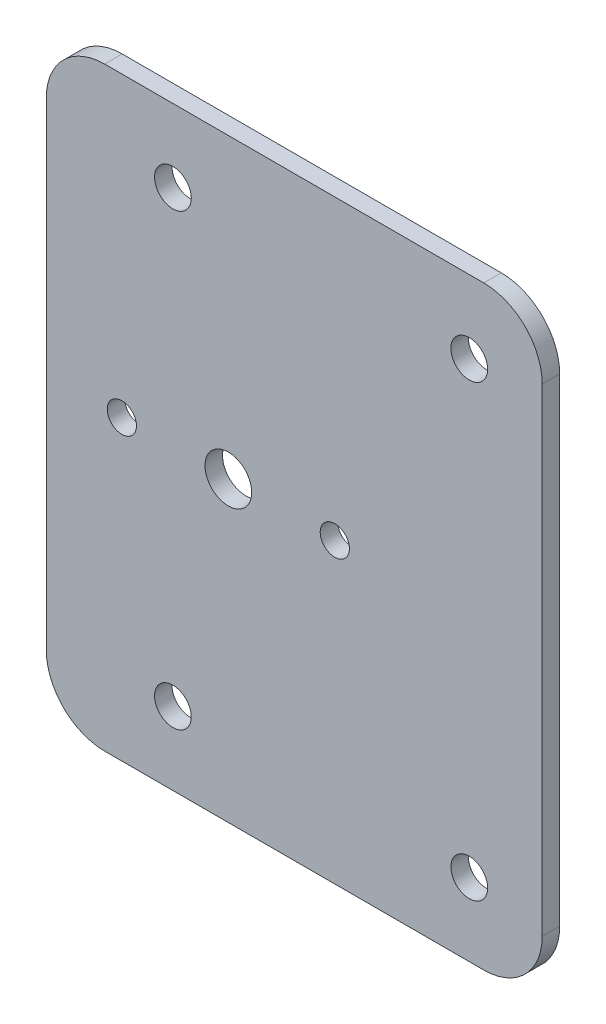
ISO-10303-21;
HEADER;
FILE_DESCRIPTION(('STEP AP214'),'2;1');
FILE_NAME('part.step','',(''),(''),'','','');
FILE_SCHEMA(('AUTOMOTIVE_DESIGN { 1 0 10303 214 1 1 1 1 }'));
ENDSEC;
DATA;
#1=APPLICATION_CONTEXT('core data for automotive mechanical design processes');
#2=APPLICATION_PROTOCOL_DEFINITION('international standard','automotive_design',2000,#1);
#3=PRODUCT_CONTEXT('',#1,'mechanical');
#4=PRODUCT('Part','Part','',(#3));
#5=PRODUCT_RELATED_PRODUCT_CATEGORY('part','',(#4));
#6=PRODUCT_DEFINITION_FORMATION('','',#4);
#7=PRODUCT_DEFINITION_CONTEXT('part definition',#1,'design');
#8=PRODUCT_DEFINITION('design','',#6,#7);
#9=PRODUCT_DEFINITION_SHAPE('','',#8);
#10=(LENGTH_UNIT() NAMED_UNIT(*) SI_UNIT(.MILLI.,.METRE.));
#11=(NAMED_UNIT(*) PLANE_ANGLE_UNIT() SI_UNIT($,.RADIAN.));
#12=(NAMED_UNIT(*) SI_UNIT($,.STERADIAN.) SOLID_ANGLE_UNIT());
#13=UNCERTAINTY_MEASURE_WITH_UNIT(LENGTH_MEASURE(1.E-05),#10,'distance_accuracy_value','');
#14=(GEOMETRIC_REPRESENTATION_CONTEXT(3) GLOBAL_UNCERTAINTY_ASSIGNED_CONTEXT((#13)) GLOBAL_UNIT_ASSIGNED_CONTEXT((#10,
#11,#12)) REPRESENTATION_CONTEXT('',''));
#15=CARTESIAN_POINT('',(0.,0.,0.));
#16=DIRECTION('',(0.,0.,1.));
#17=DIRECTION('',(1.,0.,0.));
#18=AXIS2_PLACEMENT_3D('',#15,#16,#17);
#19=CARTESIAN_POINT('',(0.,0.,3.));
#20=DIRECTION('',(0.,0.,1.));
#21=DIRECTION('',(1.,0.,0.));
#22=AXIS2_PLACEMENT_3D('',#19,#20,#21);
#23=PLANE('',#22);
#24=CARTESIAN_POINT('',(41.3,-38.5,3.));
#25=DIRECTION('',(0.,0.,1.));
#26=DIRECTION('',(-1.,0.,0.));
#27=AXIS2_PLACEMENT_3D('',#24,#25,#26);
#28=CIRCLE('',#27,3.15);
#29=CARTESIAN_POINT('',(38.15,-38.5,3.));
#30=VERTEX_POINT('',#29);
#31=EDGE_CURVE('E233',#30,#30,#28,.T.);
#32=ORIENTED_EDGE('',*,*,#31,.F.);
#33=EDGE_LOOP('',(#32));
#34=FACE_BOUND('',#33,.T.);
#35=CARTESIAN_POINT('',(-9.5,38.5,3.));
#36=DIRECTION('',(0.,0.,1.));
#37=DIRECTION('',(1.,0.,0.));
#38=AXIS2_PLACEMENT_3D('',#35,#36,#37);
#39=CIRCLE('',#38,3.15);
#40=CARTESIAN_POINT('',(-6.35,38.5,3.));
#41=VERTEX_POINT('',#40);
#42=EDGE_CURVE('E248',#41,#41,#39,.T.);
#43=ORIENTED_EDGE('',*,*,#42,.F.);
#44=EDGE_LOOP('',(#43));
#45=FACE_BOUND('',#44,.T.);
#46=CARTESIAN_POINT('',(18.25,0.,3.));
#47=DIRECTION('',(0.,0.,1.));
#48=DIRECTION('',(1.,0.,0.));
#49=AXIS2_PLACEMENT_3D('',#46,#47,#48);
#50=CIRCLE('',#49,2.5);
#51=CARTESIAN_POINT('',(20.75,0.,3.));
#52=VERTEX_POINT('',#51);
#53=EDGE_CURVE('E262',#52,#52,#50,.T.);
#54=ORIENTED_EDGE('',*,*,#53,.F.);
#55=EDGE_LOOP('',(#54));
#56=FACE_BOUND('',#55,.T.);
#57=DIRECTION('',(0.,-1.,0.));
#58=VECTOR('',#57,1.);
#59=CARTESIAN_POINT('',(-31.2,51.,3.));
#60=LINE('',#59,#58);
#61=CARTESIAN_POINT('',(-31.2,41.,3.));
#62=VERTEX_POINT('',#61);
#63=CARTESIAN_POINT('',(-31.2,-41.,3.));
#64=VERTEX_POINT('',#63);
#65=EDGE_CURVE('E149',#62,#64,#60,.T.);
#66=ORIENTED_EDGE('',*,*,#65,.T.);
#67=CARTESIAN_POINT('',(-21.2,-41.,3.));
#68=DIRECTION('',(0.,0.,1.));
#69=DIRECTION('',(1.,0.,0.));
#70=AXIS2_PLACEMENT_3D('',#67,#68,#69);
#71=CIRCLE('',#70,10.);
#72=CARTESIAN_POINT('',(-21.2,-51.,3.));
#73=VERTEX_POINT('',#72);
#74=EDGE_CURVE('E173',#64,#73,#71,.T.);
#75=ORIENTED_EDGE('',*,*,#74,.T.);
#76=DIRECTION('',(1.,0.,0.));
#77=VECTOR('',#76,1.);
#78=CARTESIAN_POINT('',(-31.2,-51.,3.));
#79=LINE('',#78,#77);
#80=CARTESIAN_POINT('',(43.8,-51.,3.));
#81=VERTEX_POINT('',#80);
#82=EDGE_CURVE('E126',#73,#81,#79,.T.);
#83=ORIENTED_EDGE('',*,*,#82,.T.);
#84=CARTESIAN_POINT('',(43.8,-41.,3.));
#85=DIRECTION('',(0.,0.,1.));
#86=DIRECTION('',(1.,0.,0.));
#87=AXIS2_PLACEMENT_3D('',#84,#85,#86);
#88=CIRCLE('',#87,10.);
#89=CARTESIAN_POINT('',(53.8,-41.,3.));
#90=VERTEX_POINT('',#89);
#91=EDGE_CURVE('E170',#81,#90,#88,.T.);
#92=ORIENTED_EDGE('',*,*,#91,.T.);
#93=DIRECTION('',(0.,1.,0.));
#94=VECTOR('',#93,1.);
#95=CARTESIAN_POINT('',(53.8,51.,3.));
#96=LINE('',#95,#94);
#97=CARTESIAN_POINT('',(53.8,41.,3.));
#98=VERTEX_POINT('',#97);
#99=EDGE_CURVE('E199',#90,#98,#96,.T.);
#100=ORIENTED_EDGE('',*,*,#99,.T.);
#101=CARTESIAN_POINT('',(43.8,41.,3.));
#102=DIRECTION('',(0.,0.,1.));
#103=DIRECTION('',(1.,0.,0.));
#104=AXIS2_PLACEMENT_3D('',#101,#102,#103);
#105=CIRCLE('',#104,10.);
#106=CARTESIAN_POINT('',(43.8,51.,3.));
#107=VERTEX_POINT('',#106);
#108=EDGE_CURVE('E60',#98,#107,#105,.T.);
#109=ORIENTED_EDGE('',*,*,#108,.T.);
#110=DIRECTION('',(-1.,0.,0.));
#111=VECTOR('',#110,1.);
#112=CARTESIAN_POINT('',(-31.2,51.,3.));
#113=LINE('',#112,#111);
#114=CARTESIAN_POINT('',(-21.2,51.,3.));
#115=VERTEX_POINT('',#114);
#116=EDGE_CURVE('E151',#107,#115,#113,.T.);
#117=ORIENTED_EDGE('',*,*,#116,.T.);
#118=CARTESIAN_POINT('',(-21.2,41.,3.));
#119=DIRECTION('',(0.,0.,1.));
#120=DIRECTION('',(1.,0.,0.));
#121=AXIS2_PLACEMENT_3D('',#118,#119,#120);
#122=CIRCLE('',#121,10.);
#123=EDGE_CURVE('E167',#115,#62,#122,.T.);
#124=ORIENTED_EDGE('',*,*,#123,.T.);
#125=EDGE_LOOP('',(#66,#75,#83,#92,#100,#109,#117,#124));
#126=FACE_BOUND('',#125,.T.);
#127=CARTESIAN_POINT('',(0.,0.,3.));
#128=DIRECTION('',(0.,0.,1.));
#129=DIRECTION('',(1.,0.,0.));
#130=AXIS2_PLACEMENT_3D('',#127,#128,#129);
#131=CIRCLE('',#130,4.);
#132=CARTESIAN_POINT('',(4.,0.,3.));
#133=VERTEX_POINT('',#132);
#134=EDGE_CURVE('E143',#133,#133,#131,.T.);
#135=ORIENTED_EDGE('',*,*,#134,.F.);
#136=EDGE_LOOP('',(#135));
#137=FACE_BOUND('',#136,.T.);
#138=CARTESIAN_POINT('',(-18.25,0.,3.));
#139=DIRECTION('',(0.,0.,1.));
#140=DIRECTION('',(-1.,0.,0.));
#141=AXIS2_PLACEMENT_3D('',#138,#139,#140);
#142=CIRCLE('',#141,2.5);
#143=CARTESIAN_POINT('',(-20.75,0.,3.));
#144=VERTEX_POINT('',#143);
#145=EDGE_CURVE('E217',#144,#144,#142,.T.);
#146=ORIENTED_EDGE('',*,*,#145,.F.);
#147=EDGE_LOOP('',(#146));
#148=FACE_BOUND('',#147,.T.);
#149=CARTESIAN_POINT('',(41.3,38.5,3.));
#150=DIRECTION('',(0.,0.,1.));
#151=DIRECTION('',(1.,0.,0.));
#152=AXIS2_PLACEMENT_3D('',#149,#150,#151);
#153=CIRCLE('',#152,3.15);
#154=CARTESIAN_POINT('',(44.45,38.5,3.));
#155=VERTEX_POINT('',#154);
#156=EDGE_CURVE('E221',#155,#155,#153,.T.);
#157=ORIENTED_EDGE('',*,*,#156,.F.);
#158=EDGE_LOOP('',(#157));
#159=FACE_BOUND('',#158,.T.);
#160=CARTESIAN_POINT('',(-9.5,-38.5,3.));
#161=DIRECTION('',(0.,0.,1.));
#162=DIRECTION('',(-1.,0.,0.));
#163=AXIS2_PLACEMENT_3D('',#160,#161,#162);
#164=CIRCLE('',#163,3.15);
#165=CARTESIAN_POINT('',(-12.65,-38.5,3.));
#166=VERTEX_POINT('',#165);
#167=EDGE_CURVE('E224',#166,#166,#164,.T.);
#168=ORIENTED_EDGE('',*,*,#167,.F.);
#169=EDGE_LOOP('',(#168));
#170=FACE_BOUND('',#169,.T.);
#171=ADVANCED_FACE('F39',(#34,#45,#56,#126,#137,#148,#159,#170),#23,.T.);
#172=CARTESIAN_POINT('',(0.,0.,0.));
#173=DIRECTION('',(0.,0.,1.));
#174=DIRECTION('',(1.,0.,0.));
#175=AXIS2_PLACEMENT_3D('',#172,#173,#174);
#176=PLANE('',#175);
#177=DIRECTION('',(1.,0.,0.));
#178=VECTOR('',#177,1.);
#179=CARTESIAN_POINT('',(-31.2,-51.,0.));
#180=LINE('',#179,#178);
#181=CARTESIAN_POINT('',(-21.2,-51.,0.));
#182=VERTEX_POINT('',#181);
#183=CARTESIAN_POINT('',(43.8,-51.,0.));
#184=VERTEX_POINT('',#183);
#185=EDGE_CURVE('E123',#182,#184,#180,.T.);
#186=ORIENTED_EDGE('',*,*,#185,.F.);
#187=CARTESIAN_POINT('',(-21.2,-41.,0.));
#188=DIRECTION('',(0.,0.,1.));
#189=DIRECTION('',(1.,0.,0.));
#190=AXIS2_PLACEMENT_3D('',#187,#188,#189);
#191=CIRCLE('',#190,10.);
#192=CARTESIAN_POINT('',(-31.2,-41.,0.));
#193=VERTEX_POINT('',#192);
#194=EDGE_CURVE('E105',#182,#193,#191,.F.);
#195=ORIENTED_EDGE('',*,*,#194,.T.);
#196=DIRECTION('',(0.,-1.,0.));
#197=VECTOR('',#196,1.);
#198=CARTESIAN_POINT('',(-31.2,51.,0.));
#199=LINE('',#198,#197);
#200=CARTESIAN_POINT('',(-31.2,41.,0.));
#201=VERTEX_POINT('',#200);
#202=EDGE_CURVE('E136',#201,#193,#199,.T.);
#203=ORIENTED_EDGE('',*,*,#202,.F.);
#204=CARTESIAN_POINT('',(-21.2,41.,0.));
#205=DIRECTION('',(0.,0.,1.));
#206=DIRECTION('',(1.,0.,0.));
#207=AXIS2_PLACEMENT_3D('',#204,#205,#206);
#208=CIRCLE('',#207,10.);
#209=CARTESIAN_POINT('',(-21.2,51.,0.));
#210=VERTEX_POINT('',#209);
#211=EDGE_CURVE('E155',#201,#210,#208,.F.);
#212=ORIENTED_EDGE('',*,*,#211,.T.);
#213=DIRECTION('',(-1.,0.,0.));
#214=VECTOR('',#213,1.);
#215=CARTESIAN_POINT('',(-31.2,51.,0.));
#216=LINE('',#215,#214);
#217=CARTESIAN_POINT('',(43.8,51.,0.));
#218=VERTEX_POINT('',#217);
#219=EDGE_CURVE('E141',#218,#210,#216,.T.);
#220=ORIENTED_EDGE('',*,*,#219,.F.);
#221=CARTESIAN_POINT('',(43.8,41.,0.));
#222=DIRECTION('',(0.,0.,1.));
#223=DIRECTION('',(1.,0.,0.));
#224=AXIS2_PLACEMENT_3D('',#221,#222,#223);
#225=CIRCLE('',#224,10.);
#226=CARTESIAN_POINT('',(53.8,41.,0.));
#227=VERTEX_POINT('',#226);
#228=EDGE_CURVE('E128',#218,#227,#225,.F.);
#229=ORIENTED_EDGE('',*,*,#228,.T.);
#230=DIRECTION('',(0.,1.,0.));
#231=VECTOR('',#230,1.);
#232=CARTESIAN_POINT('',(53.8,51.,0.));
#233=LINE('',#232,#231);
#234=CARTESIAN_POINT('',(53.8,-41.,0.));
#235=VERTEX_POINT('',#234);
#236=EDGE_CURVE('E135',#235,#227,#233,.T.);
#237=ORIENTED_EDGE('',*,*,#236,.F.);
#238=CARTESIAN_POINT('',(43.8,-41.,0.));
#239=DIRECTION('',(0.,0.,1.));
#240=DIRECTION('',(1.,0.,0.));
#241=AXIS2_PLACEMENT_3D('',#238,#239,#240);
#242=CIRCLE('',#241,10.);
#243=EDGE_CURVE('E117',#235,#184,#242,.F.);
#244=ORIENTED_EDGE('',*,*,#243,.T.);
#245=EDGE_LOOP('',(#186,#195,#203,#212,#220,#229,#237,#244));
#246=FACE_BOUND('',#245,.T.);
#247=CARTESIAN_POINT('',(0.,0.,0.));
#248=DIRECTION('',(0.,0.,1.));
#249=DIRECTION('',(1.,0.,0.));
#250=AXIS2_PLACEMENT_3D('',#247,#248,#249);
#251=CIRCLE('',#250,4.);
#252=CARTESIAN_POINT('',(4.,0.,0.));
#253=VERTEX_POINT('',#252);
#254=EDGE_CURVE('E202',#253,#253,#251,.T.);
#255=ORIENTED_EDGE('',*,*,#254,.T.);
#256=EDGE_LOOP('',(#255));
#257=FACE_BOUND('',#256,.T.);
#258=CARTESIAN_POINT('',(18.25,0.,0.));
#259=DIRECTION('',(0.,0.,1.));
#260=DIRECTION('',(1.,0.,0.));
#261=AXIS2_PLACEMENT_3D('',#258,#259,#260);
#262=CIRCLE('',#261,2.5);
#263=CARTESIAN_POINT('',(20.75,0.,0.));
#264=VERTEX_POINT('',#263);
#265=EDGE_CURVE('E258',#264,#264,#262,.T.);
#266=ORIENTED_EDGE('',*,*,#265,.T.);
#267=EDGE_LOOP('',(#266));
#268=FACE_BOUND('',#267,.T.);
#269=CARTESIAN_POINT('',(-18.25,0.,0.));
#270=DIRECTION('',(0.,0.,1.));
#271=DIRECTION('',(-1.,0.,0.));
#272=AXIS2_PLACEMENT_3D('',#269,#270,#271);
#273=CIRCLE('',#272,2.5);
#274=CARTESIAN_POINT('',(-20.75,0.,0.));
#275=VERTEX_POINT('',#274);
#276=EDGE_CURVE('E252',#275,#275,#273,.T.);
#277=ORIENTED_EDGE('',*,*,#276,.T.);
#278=EDGE_LOOP('',(#277));
#279=FACE_BOUND('',#278,.T.);
#280=CARTESIAN_POINT('',(-9.5,38.5,0.));
#281=DIRECTION('',(0.,0.,1.));
#282=DIRECTION('',(1.,0.,0.));
#283=AXIS2_PLACEMENT_3D('',#280,#281,#282);
#284=CIRCLE('',#283,3.15);
#285=CARTESIAN_POINT('',(-6.35,38.5,0.));
#286=VERTEX_POINT('',#285);
#287=EDGE_CURVE('E244',#286,#286,#284,.T.);
#288=ORIENTED_EDGE('',*,*,#287,.T.);
#289=EDGE_LOOP('',(#288));
#290=FACE_BOUND('',#289,.T.);
#291=CARTESIAN_POINT('',(41.3,38.5,0.));
#292=DIRECTION('',(0.,0.,1.));
#293=DIRECTION('',(1.,0.,0.));
#294=AXIS2_PLACEMENT_3D('',#291,#292,#293);
#295=CIRCLE('',#294,3.15);
#296=CARTESIAN_POINT('',(44.45,38.5,0.));
#297=VERTEX_POINT('',#296);
#298=EDGE_CURVE('E240',#297,#297,#295,.T.);
#299=ORIENTED_EDGE('',*,*,#298,.T.);
#300=EDGE_LOOP('',(#299));
#301=FACE_BOUND('',#300,.T.);
#302=CARTESIAN_POINT('',(41.3,-38.5,0.));
#303=DIRECTION('',(0.,0.,1.));
#304=DIRECTION('',(-1.,0.,0.));
#305=AXIS2_PLACEMENT_3D('',#302,#303,#304);
#306=CIRCLE('',#305,3.15);
#307=CARTESIAN_POINT('',(38.15,-38.5,0.));
#308=VERTEX_POINT('',#307);
#309=EDGE_CURVE('E227',#308,#308,#306,.T.);
#310=ORIENTED_EDGE('',*,*,#309,.T.);
#311=EDGE_LOOP('',(#310));
#312=FACE_BOUND('',#311,.T.);
#313=CARTESIAN_POINT('',(-9.5,-38.5,0.));
#314=DIRECTION('',(0.,0.,1.));
#315=DIRECTION('',(-1.,0.,0.));
#316=AXIS2_PLACEMENT_3D('',#313,#314,#315);
#317=CIRCLE('',#316,3.15);
#318=CARTESIAN_POINT('',(-12.65,-38.5,0.));
#319=VERTEX_POINT('',#318);
#320=EDGE_CURVE('E228',#319,#319,#317,.T.);
#321=ORIENTED_EDGE('',*,*,#320,.T.);
#322=EDGE_LOOP('',(#321));
#323=FACE_BOUND('',#322,.T.);
#324=ADVANCED_FACE('F131',(#246,#257,#268,#279,#290,#301,#312,#323),#176,.F.);
#325=CARTESIAN_POINT('',(-31.2,51.,3.));
#326=DIRECTION('',(1.,0.,0.));
#327=DIRECTION('',(0.,0.,-1.));
#328=AXIS2_PLACEMENT_3D('',#325,#326,#327);
#329=PLANE('',#328);
#330=ORIENTED_EDGE('',*,*,#202,.T.);
#331=DIRECTION('',(0.,0.,-1.));
#332=VECTOR('',#331,1.);
#333=CARTESIAN_POINT('',(-31.2,-41.,3.));
#334=LINE('',#333,#332);
#335=EDGE_CURVE('E110',#193,#64,#334,.F.);
#336=ORIENTED_EDGE('',*,*,#335,.T.);
#337=ORIENTED_EDGE('',*,*,#65,.F.);
#338=DIRECTION('',(0.,0.,-1.));
#339=VECTOR('',#338,1.);
#340=CARTESIAN_POINT('',(-31.2,41.,3.));
#341=LINE('',#340,#339);
#342=EDGE_CURVE('E116',#62,#201,#341,.T.);
#343=ORIENTED_EDGE('',*,*,#342,.T.);
#344=EDGE_LOOP('',(#330,#336,#337,#343));
#345=FACE_BOUND('',#344,.T.);
#346=ADVANCED_FACE('F194',(#345),#329,.F.);
#347=CARTESIAN_POINT('',(-31.2,-51.,3.));
#348=DIRECTION('',(0.,1.,0.));
#349=DIRECTION('',(0.,0.,1.));
#350=AXIS2_PLACEMENT_3D('',#347,#348,#349);
#351=PLANE('',#350);
#352=ORIENTED_EDGE('',*,*,#82,.F.);
#353=DIRECTION('',(0.,0.,-1.));
#354=VECTOR('',#353,1.);
#355=CARTESIAN_POINT('',(-21.2,-51.,3.));
#356=LINE('',#355,#354);
#357=EDGE_CURVE('E109',#73,#182,#356,.T.);
#358=ORIENTED_EDGE('',*,*,#357,.T.);
#359=ORIENTED_EDGE('',*,*,#185,.T.);
#360=DIRECTION('',(0.,0.,-1.));
#361=VECTOR('',#360,1.);
#362=CARTESIAN_POINT('',(43.8,-51.,3.));
#363=LINE('',#362,#361);
#364=EDGE_CURVE('E129',#184,#81,#363,.F.);
#365=ORIENTED_EDGE('',*,*,#364,.T.);
#366=EDGE_LOOP('',(#352,#358,#359,#365));
#367=FACE_BOUND('',#366,.T.);
#368=ADVANCED_FACE('F122',(#367),#351,.F.);
#369=CARTESIAN_POINT('',(53.8,51.,3.));
#370=DIRECTION('',(-1.,0.,0.));
#371=DIRECTION('',(0.,0.,1.));
#372=AXIS2_PLACEMENT_3D('',#369,#370,#371);
#373=PLANE('',#372);
#374=ORIENTED_EDGE('',*,*,#99,.F.);
#375=DIRECTION('',(0.,0.,-1.));
#376=VECTOR('',#375,1.);
#377=CARTESIAN_POINT('',(53.8,-41.,3.));
#378=LINE('',#377,#376);
#379=EDGE_CURVE('E179',#90,#235,#378,.T.);
#380=ORIENTED_EDGE('',*,*,#379,.T.);
#381=ORIENTED_EDGE('',*,*,#236,.T.);
#382=DIRECTION('',(0.,0.,-1.));
#383=VECTOR('',#382,1.);
#384=CARTESIAN_POINT('',(53.8,41.,3.));
#385=LINE('',#384,#383);
#386=EDGE_CURVE('E176',#227,#98,#385,.F.);
#387=ORIENTED_EDGE('',*,*,#386,.T.);
#388=EDGE_LOOP('',(#374,#380,#381,#387));
#389=FACE_BOUND('',#388,.T.);
#390=ADVANCED_FACE('F286',(#389),#373,.F.);
#391=CARTESIAN_POINT('',(-31.2,51.,3.));
#392=DIRECTION('',(0.,-1.,0.));
#393=DIRECTION('',(0.,0.,-1.));
#394=AXIS2_PLACEMENT_3D('',#391,#392,#393);
#395=PLANE('',#394);
#396=ORIENTED_EDGE('',*,*,#219,.T.);
#397=DIRECTION('',(0.,0.,-1.));
#398=VECTOR('',#397,1.);
#399=CARTESIAN_POINT('',(-21.2,51.,3.));
#400=LINE('',#399,#398);
#401=EDGE_CURVE('E11',#210,#115,#400,.F.);
#402=ORIENTED_EDGE('',*,*,#401,.T.);
#403=ORIENTED_EDGE('',*,*,#116,.F.);
#404=DIRECTION('',(0.,0.,-1.));
#405=VECTOR('',#404,1.);
#406=CARTESIAN_POINT('',(43.8,51.,3.));
#407=LINE('',#406,#405);
#408=EDGE_CURVE('E48',#107,#218,#407,.T.);
#409=ORIENTED_EDGE('',*,*,#408,.T.);
#410=EDGE_LOOP('',(#396,#402,#403,#409));
#411=FACE_BOUND('',#410,.T.);
#412=ADVANCED_FACE('F186',(#411),#395,.F.);
#413=CARTESIAN_POINT('',(0.,0.,3.));
#414=DIRECTION('',(0.,0.,-1.));
#415=DIRECTION('',(-1.,0.,0.));
#416=AXIS2_PLACEMENT_3D('',#413,#414,#415);
#417=CYLINDRICAL_SURFACE('',#416,4.);
#418=ORIENTED_EDGE('',*,*,#134,.T.);
#419=EDGE_LOOP('',(#418));
#420=FACE_BOUND('',#419,.T.);
#421=ORIENTED_EDGE('',*,*,#254,.F.);
#422=EDGE_LOOP('',(#421));
#423=FACE_BOUND('',#422,.T.);
#424=ADVANCED_FACE('F275',(#420,#423),#417,.F.);
#425=CARTESIAN_POINT('',(18.25,0.,3.));
#426=DIRECTION('',(0.,0.,-1.));
#427=DIRECTION('',(-1.,0.,0.));
#428=AXIS2_PLACEMENT_3D('',#425,#426,#427);
#429=CYLINDRICAL_SURFACE('',#428,2.5);
#430=ORIENTED_EDGE('',*,*,#53,.T.);
#431=EDGE_LOOP('',(#430));
#432=FACE_BOUND('',#431,.T.);
#433=ORIENTED_EDGE('',*,*,#265,.F.);
#434=EDGE_LOOP('',(#433));
#435=FACE_BOUND('',#434,.T.);
#436=ADVANCED_FACE('F277',(#432,#435),#429,.F.);
#437=CARTESIAN_POINT('',(-18.25,0.,3.));
#438=DIRECTION('',(0.,0.,-1.));
#439=DIRECTION('',(-1.,0.,0.));
#440=AXIS2_PLACEMENT_3D('',#437,#438,#439);
#441=CYLINDRICAL_SURFACE('',#440,2.5);
#442=ORIENTED_EDGE('',*,*,#145,.T.);
#443=EDGE_LOOP('',(#442));
#444=FACE_BOUND('',#443,.T.);
#445=ORIENTED_EDGE('',*,*,#276,.F.);
#446=EDGE_LOOP('',(#445));
#447=FACE_BOUND('',#446,.T.);
#448=ADVANCED_FACE('F283',(#444,#447),#441,.F.);
#449=CARTESIAN_POINT('',(-9.5,38.5,3.));
#450=DIRECTION('',(0.,0.,-1.));
#451=DIRECTION('',(-1.,0.,0.));
#452=AXIS2_PLACEMENT_3D('',#449,#450,#451);
#453=CYLINDRICAL_SURFACE('',#452,3.15);
#454=ORIENTED_EDGE('',*,*,#42,.T.);
#455=EDGE_LOOP('',(#454));
#456=FACE_BOUND('',#455,.T.);
#457=ORIENTED_EDGE('',*,*,#287,.F.);
#458=EDGE_LOOP('',(#457));
#459=FACE_BOUND('',#458,.T.);
#460=ADVANCED_FACE('F396',(#456,#459),#453,.F.);
#461=CARTESIAN_POINT('',(41.3,38.5,3.));
#462=DIRECTION('',(0.,0.,-1.));
#463=DIRECTION('',(-1.,0.,0.));
#464=AXIS2_PLACEMENT_3D('',#461,#462,#463);
#465=CYLINDRICAL_SURFACE('',#464,3.15);
#466=ORIENTED_EDGE('',*,*,#156,.T.);
#467=EDGE_LOOP('',(#466));
#468=FACE_BOUND('',#467,.T.);
#469=ORIENTED_EDGE('',*,*,#298,.F.);
#470=EDGE_LOOP('',(#469));
#471=FACE_BOUND('',#470,.T.);
#472=ADVANCED_FACE('F386',(#468,#471),#465,.F.);
#473=CARTESIAN_POINT('',(41.3,-38.5,3.));
#474=DIRECTION('',(0.,0.,-1.));
#475=DIRECTION('',(-1.,0.,0.));
#476=AXIS2_PLACEMENT_3D('',#473,#474,#475);
#477=CYLINDRICAL_SURFACE('',#476,3.15);
#478=ORIENTED_EDGE('',*,*,#31,.T.);
#479=EDGE_LOOP('',(#478));
#480=FACE_BOUND('',#479,.T.);
#481=ORIENTED_EDGE('',*,*,#309,.F.);
#482=EDGE_LOOP('',(#481));
#483=FACE_BOUND('',#482,.T.);
#484=ADVANCED_FACE('F377',(#480,#483),#477,.F.);
#485=CARTESIAN_POINT('',(-9.5,-38.5,3.));
#486=DIRECTION('',(0.,0.,-1.));
#487=DIRECTION('',(-1.,0.,0.));
#488=AXIS2_PLACEMENT_3D('',#485,#486,#487);
#489=CYLINDRICAL_SURFACE('',#488,3.15);
#490=ORIENTED_EDGE('',*,*,#167,.T.);
#491=EDGE_LOOP('',(#490));
#492=FACE_BOUND('',#491,.T.);
#493=ORIENTED_EDGE('',*,*,#320,.F.);
#494=EDGE_LOOP('',(#493));
#495=FACE_BOUND('',#494,.T.);
#496=ADVANCED_FACE('F302',(#492,#495),#489,.F.);
#497=CARTESIAN_POINT('',(-21.2,-41.,3.));
#498=DIRECTION('',(0.,0.,-1.));
#499=DIRECTION('',(-1.,0.,0.));
#500=AXIS2_PLACEMENT_3D('',#497,#498,#499);
#501=CYLINDRICAL_SURFACE('',#500,10.);
#502=ORIENTED_EDGE('',*,*,#74,.F.);
#503=ORIENTED_EDGE('',*,*,#335,.F.);
#504=ORIENTED_EDGE('',*,*,#194,.F.);
#505=ORIENTED_EDGE('',*,*,#357,.F.);
#506=EDGE_LOOP('',(#502,#503,#504,#505));
#507=FACE_BOUND('',#506,.T.);
#508=ADVANCED_FACE('F108',(#507),#501,.T.);
#509=CARTESIAN_POINT('',(43.8,-41.,3.));
#510=DIRECTION('',(0.,0.,-1.));
#511=DIRECTION('',(-1.,0.,0.));
#512=AXIS2_PLACEMENT_3D('',#509,#510,#511);
#513=CYLINDRICAL_SURFACE('',#512,10.);
#514=ORIENTED_EDGE('',*,*,#91,.F.);
#515=ORIENTED_EDGE('',*,*,#364,.F.);
#516=ORIENTED_EDGE('',*,*,#243,.F.);
#517=ORIENTED_EDGE('',*,*,#379,.F.);
#518=EDGE_LOOP('',(#514,#515,#516,#517));
#519=FACE_BOUND('',#518,.T.);
#520=ADVANCED_FACE('F301',(#519),#513,.T.);
#521=CARTESIAN_POINT('',(-21.2,41.,3.));
#522=DIRECTION('',(0.,0.,-1.));
#523=DIRECTION('',(-1.,0.,0.));
#524=AXIS2_PLACEMENT_3D('',#521,#522,#523);
#525=CYLINDRICAL_SURFACE('',#524,10.);
#526=ORIENTED_EDGE('',*,*,#123,.F.);
#527=ORIENTED_EDGE('',*,*,#401,.F.);
#528=ORIENTED_EDGE('',*,*,#211,.F.);
#529=ORIENTED_EDGE('',*,*,#342,.F.);
#530=EDGE_LOOP('',(#526,#527,#528,#529));
#531=FACE_BOUND('',#530,.T.);
#532=ADVANCED_FACE('F191',(#531),#525,.T.);
#533=CARTESIAN_POINT('',(43.8,41.,3.));
#534=DIRECTION('',(0.,0.,-1.));
#535=DIRECTION('',(-1.,0.,0.));
#536=AXIS2_PLACEMENT_3D('',#533,#534,#535);
#537=CYLINDRICAL_SURFACE('',#536,10.);
#538=ORIENTED_EDGE('',*,*,#108,.F.);
#539=ORIENTED_EDGE('',*,*,#386,.F.);
#540=ORIENTED_EDGE('',*,*,#228,.F.);
#541=ORIENTED_EDGE('',*,*,#408,.F.);
#542=EDGE_LOOP('',(#538,#539,#540,#541));
#543=FACE_BOUND('',#542,.T.);
#544=ADVANCED_FACE('F41',(#543),#537,.T.);
#545=CLOSED_SHELL('',(#171,#324,#346,#368,#390,#412,#424,#436,#448,#460,#472,#484,#496,#508,
#520,#532,#544));
#546=MANIFOLD_SOLID_BREP('B2',#545);
#547=ADVANCED_BREP_SHAPE_REPRESENTATION('',(#18,#546),#14);
#548=SHAPE_DEFINITION_REPRESENTATION(#9,#547);
ENDSEC;
END-ISO-10303-21;
